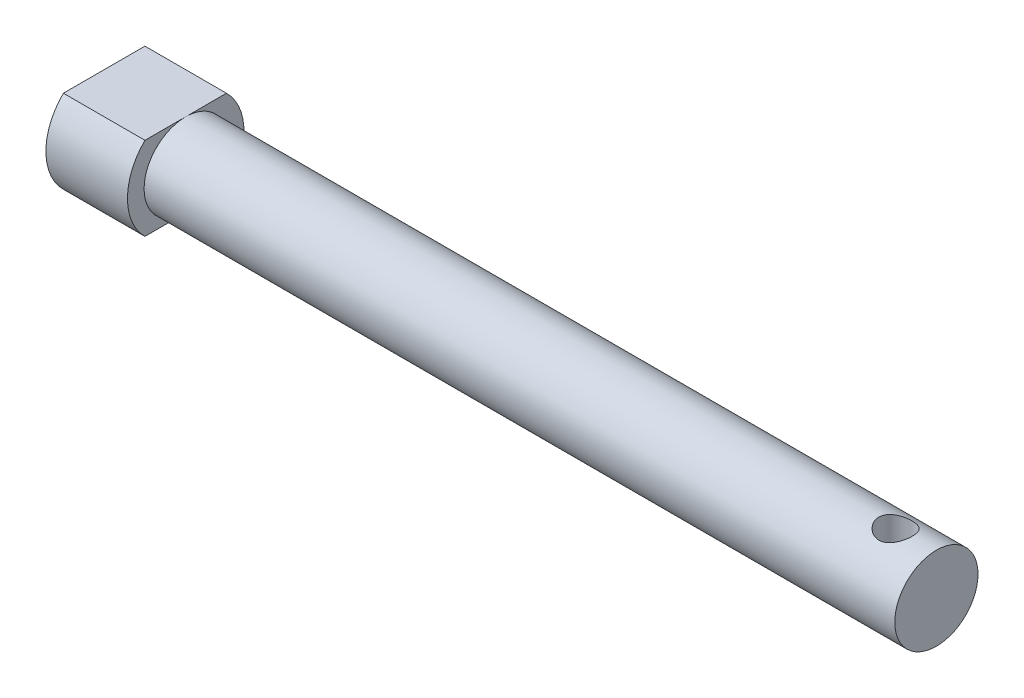
ISO-10303-21;
HEADER;
FILE_DESCRIPTION(('STEP AP214'),'2;1');
FILE_NAME('part.step','',(''),(''),'','','');
FILE_SCHEMA(('AUTOMOTIVE_DESIGN { 1 0 10303 214 1 1 1 1 }'));
ENDSEC;
DATA;
#1=APPLICATION_CONTEXT('core data for automotive mechanical design processes');
#2=APPLICATION_PROTOCOL_DEFINITION('international standard','automotive_design',2000,#1);
#3=PRODUCT_CONTEXT('',#1,'mechanical');
#4=PRODUCT('Part','Part','',(#3));
#5=PRODUCT_RELATED_PRODUCT_CATEGORY('part','',(#4));
#6=PRODUCT_DEFINITION_FORMATION('','',#4);
#7=PRODUCT_DEFINITION_CONTEXT('part definition',#1,'design');
#8=PRODUCT_DEFINITION('design','',#6,#7);
#9=PRODUCT_DEFINITION_SHAPE('','',#8);
#10=(LENGTH_UNIT() NAMED_UNIT(*) SI_UNIT(.MILLI.,.METRE.));
#11=(NAMED_UNIT(*) PLANE_ANGLE_UNIT() SI_UNIT($,.RADIAN.));
#12=(NAMED_UNIT(*) SI_UNIT($,.STERADIAN.) SOLID_ANGLE_UNIT());
#13=UNCERTAINTY_MEASURE_WITH_UNIT(LENGTH_MEASURE(1.E-05),#10,'distance_accuracy_value','');
#14=(GEOMETRIC_REPRESENTATION_CONTEXT(3) GLOBAL_UNCERTAINTY_ASSIGNED_CONTEXT((#13)) GLOBAL_UNIT_ASSIGNED_CONTEXT((#10,
#11,#12)) REPRESENTATION_CONTEXT('',''));
#15=CARTESIAN_POINT('',(0.,0.,0.));
#16=DIRECTION('',(0.,0.,1.));
#17=DIRECTION('',(1.,0.,0.));
#18=AXIS2_PLACEMENT_3D('',#15,#16,#17);
#19=CARTESIAN_POINT('',(25.,0.,0.));
#20=DIRECTION('',(-1.,0.,0.));
#21=DIRECTION('',(0.,0.,1.));
#22=AXIS2_PLACEMENT_3D('',#19,#20,#21);
#23=CYLINDRICAL_SURFACE('',#22,2.5);
#24=CARTESIAN_POINT('',(22.55,2.29128784747792,1.));
#25=CARTESIAN_POINT('',(22.4964302509501,2.29129325828211,0.999994127101896));
#26=CARTESIAN_POINT('',(22.4427847326477,2.29319301242133,0.995669909297178));
#27=CARTESIAN_POINT('',(22.3370325835615,2.30055457093922,0.978534515296367));
#28=CARTESIAN_POINT('',(22.2849302414598,2.30602547693426,0.965701652221067));
#29=CARTESIAN_POINT('',(22.183973529015,2.31980227895648,0.932117516284353));
#30=CARTESIAN_POINT('',(22.1351077263199,2.32809748178557,0.911396076262713));
#31=CARTESIAN_POINT('',(22.0415574745702,2.3465733254764,0.862710134685806));
#32=CARTESIAN_POINT('',(21.9968721154246,2.35675355451961,0.83474721463375));
#33=CARTESIAN_POINT('',(21.9103697988793,2.37850432525516,0.77066098729371));
#34=CARTESIAN_POINT('',(21.8688217885353,2.39011958979373,0.734189678863664));
#35=CARTESIAN_POINT('',(21.7922355013423,2.41306228489405,0.654854552887023));
#36=CARTESIAN_POINT('',(21.7571994993551,2.42438961368186,0.611988510837841));
#37=CARTESIAN_POINT('',(21.6932968015086,2.44601703953427,0.51900315517819));
#38=CARTESIAN_POINT('',(21.6647278492647,2.45625901841784,0.468664482806142));
#39=CARTESIAN_POINT('',(21.6165782158051,2.47401963815773,0.36341266143756));
#40=CARTESIAN_POINT('',(21.596993877109,2.48153938692337,0.308501384643981));
#41=CARTESIAN_POINT('',(21.5683292567813,2.49269162504142,0.198483213419445));
#42=CARTESIAN_POINT('',(21.5587863429555,2.49649468387678,0.143514492402302));
#43=CARTESIAN_POINT('',(21.5489857571687,2.50040155341351,0.0326331643188245));
#44=CARTESIAN_POINT('',(21.5487246220326,2.50050674384656,-0.0232790829127025));
#45=CARTESIAN_POINT('',(21.5572413848875,2.49710981410893,-0.131116247357657));
#46=CARTESIAN_POINT('',(21.5655123863735,2.49380998385918,-0.183088726437018));
#47=CARTESIAN_POINT('',(21.5899964381554,2.48424645734395,-0.28483655460917));
#48=CARTESIAN_POINT('',(21.6062100712002,2.47798254360556,-0.33461174219508));
#49=CARTESIAN_POINT('',(21.6463182414382,2.4629841222885,-0.431448969255829));
#50=CARTESIAN_POINT('',(21.6703248574078,2.454213802334,-0.478458811689819));
#51=CARTESIAN_POINT('',(21.7252325034595,2.43507292589849,-0.56790407537029));
#52=CARTESIAN_POINT('',(21.7561358965488,2.42470182132537,-0.610337921358056));
#53=CARTESIAN_POINT('',(21.8263245679733,2.40260818589167,-0.692384413996077));
#54=CARTESIAN_POINT('',(21.8660269462919,2.3908416326012,-0.731628922636823));
#55=CARTESIAN_POINT('',(21.9514952859105,2.36780830482389,-0.803053707692665));
#56=CARTESIAN_POINT('',(21.9972632240771,2.35654169488173,-0.835231671879831));
#57=CARTESIAN_POINT('',(22.0952095112045,2.33548448720906,-0.892452094371468));
#58=CARTESIAN_POINT('',(22.1475324152419,2.3257445709069,-0.917267325867454));
#59=CARTESIAN_POINT('',(22.256107745231,2.30943795233662,-0.957588129983134));
#60=CARTESIAN_POINT('',(22.3123575923854,2.3028691896167,-0.973099749202201));
#61=CARTESIAN_POINT('',(22.423517888718,2.29414879836282,-0.99347747441598));
#62=CARTESIAN_POINT('',(22.4783002235601,2.29175183224038,-0.998936048404206));
#63=CARTESIAN_POINT('',(22.588038603884,2.29094748938549,-1.00078066322451));
#64=CARTESIAN_POINT('',(22.6429945916389,2.29253890281231,-0.997169455296443));
#65=CARTESIAN_POINT('',(22.7482294674774,2.29928022178566,-0.981516447394264));
#66=CARTESIAN_POINT('',(22.7985964686997,2.30422228898885,-0.969966531011731));
#67=CARTESIAN_POINT('',(22.896644202393,2.31685025513936,-0.939402093455641));
#68=CARTESIAN_POINT('',(22.9443243365537,2.32453676244372,-0.920385917151199));
#69=CARTESIAN_POINT('',(23.0378011788977,2.34216890929975,-0.874567819740729));
#70=CARTESIAN_POINT('',(23.0834430943472,2.35219352319567,-0.847481434132299));
#71=CARTESIAN_POINT('',(23.1697414937208,2.37325192578919,-0.78658261222094));
#72=CARTESIAN_POINT('',(23.2103959363978,2.38428612448031,-0.752767436740994));
#73=CARTESIAN_POINT('',(23.2886867042996,2.40710457985699,-0.676422105840242));
#74=CARTESIAN_POINT('',(23.3258782826455,2.41888403642601,-0.633432714722548));
#75=CARTESIAN_POINT('',(23.3925885383052,2.44109897283781,-0.54154181668442));
#76=CARTESIAN_POINT('',(23.4221069032986,2.4515343979662,-0.49264006923393));
#77=CARTESIAN_POINT('',(23.4725238132306,2.46991857950143,-0.39013996700088));
#78=CARTESIAN_POINT('',(23.4934244220829,2.47786793120137,-0.336542740497032));
#79=CARTESIAN_POINT('',(23.5257744262038,2.49036356734645,-0.226196795459611));
#80=CARTESIAN_POINT('',(23.53722895072,2.49491169853772,-0.169449805147134));
#81=CARTESIAN_POINT('',(23.5497523508127,2.49989504105256,-0.0584082551731509));
#82=CARTESIAN_POINT('',(23.5514500642313,2.50057923372436,-0.00419524629652686));
#83=CARTESIAN_POINT('',(23.5460722603579,2.49843021189296,0.103716917866622));
#84=CARTESIAN_POINT('',(23.5389980711072,2.49559752983456,0.157416149697311));
#85=CARTESIAN_POINT('',(23.5167266058208,2.48685756682127,0.261085450973206));
#86=CARTESIAN_POINT('',(23.5017855269622,2.48104740317165,0.311119402324194));
#87=CARTESIAN_POINT('',(23.4644735977191,2.46697473916019,0.407961177379472));
#88=CARTESIAN_POINT('',(23.4421013769898,2.45871178652006,0.454768404133639));
#89=CARTESIAN_POINT('',(23.3894484007553,2.44009047180029,0.546101520928058));
#90=CARTESIAN_POINT('',(23.3588618525575,2.42965564864115,0.590435193403213));
#91=CARTESIAN_POINT('',(23.2911057404105,2.40794701593224,0.673527014262036));
#92=CARTESIAN_POINT('',(23.2539334517699,2.3966728602525,0.712282842872879));
#93=CARTESIAN_POINT('',(23.1713423877375,2.37368881779711,0.785600632542997));
#94=CARTESIAN_POINT('',(23.1255555632995,2.36199516302692,0.819754443599515));
#95=CARTESIAN_POINT('',(23.0285289312856,2.3402483573759,0.879923725219699));
#96=CARTESIAN_POINT('',(22.9772884835451,2.33019539943728,0.905938238949995));
#97=CARTESIAN_POINT('',(22.875481399076,2.31379432228954,0.946995543836656));
#98=CARTESIAN_POINT('',(22.8252673826244,2.30719459305824,0.962813757082104));
#99=CARTESIAN_POINT('',(22.7227572901848,2.29723001801982,0.986358878909194));
#100=CARTESIAN_POINT('',(22.6704674420165,2.29385616036088,0.994108333944009));
#101=CARTESIAN_POINT('',(22.595311218831,2.29162229378817,0.999232129155088));
#102=CARTESIAN_POINT('',(22.5726623895012,2.29128555846679,1.00000248449744));
#103=CARTESIAN_POINT('',(22.55,2.29128784747792,1.));
#104=B_SPLINE_CURVE_WITH_KNOTS('',3,(#24,#25,#26,#27,#28,#29,#30,#31,#32,#33,#34,#35,#36,#37,
#38,#39,#40,#41,#42,#43,#44,#45,#46,#47,#48,#49,#50,#51,#52,#53,#54,#55,#56,#57,#58,#59,#60,#61,
#62,#63,#64,#65,#66,#67,#68,#69,#70,#71,#72,#73,#74,#75,#76,#77,#78,#79,#80,#81,#82,#83,#84,#85,
#86,#87,#88,#89,#90,#91,#92,#93,#94,#95,#96,#97,#98,#99,#100,#101,#102,#103),.UNSPECIFIED.,.T.,
.F.,(4,2,2,2,2,2,2,2,2,2,2,2,2,2,2,2,2,2,2,2,2,2,2,2,2,2,2,2,2,2,2,2,2,2,2,2,2,2,2,4),(0.,
0.160638824383824,0.321688667911124,0.482135411646697,0.64254714411931,0.811278091422126,
0.980067871741711,1.15551334545714,1.3308873348474,1.49777091443592,1.66459222652836,
1.82204322415151,1.9795057756453,2.1393415011745,2.29923207470016,2.46962022040678,
2.64006403563564,2.81532229357289,2.99046652397056,3.15491073759216,3.31930507450975,
3.47433624039577,3.62940179322824,3.79075577323356,3.9521755725993,4.12551867120496,
4.2988688242338,4.47217743653412,4.64539187974074,4.80730519874982,4.96919400753307,
5.12610997218682,5.28305488911298,5.44693525566968,5.61088358279109,5.78498126639812,
5.959099408766,6.11758330406544,6.27562315106628,6.34358052760368),.UNSPECIFIED.);
#105=CARTESIAN_POINT('',(22.55,2.29128784747792,1.));
#106=VERTEX_POINT('',#105);
#107=EDGE_CURVE('E39',#106,#106,#104,.T.);
#108=ORIENTED_EDGE('',*,*,#107,.T.);
#109=EDGE_LOOP('',(#108));
#110=FACE_BOUND('',#109,.T.);
#111=CARTESIAN_POINT('',(21.55,-2.5,0.));
#112=CARTESIAN_POINT('',(21.5500049259119,-2.49999635613542,0.053746502721446));
#113=CARTESIAN_POINT('',(21.5543588760442,-2.49824647153466,0.107586282045337));
#114=CARTESIAN_POINT('',(21.5716238517606,-2.49141726550321,0.213748240208949));
#115=CARTESIAN_POINT('',(21.5845581395431,-2.48632889349439,0.266065888780625));
#116=CARTESIAN_POINT('',(21.6184380390294,-2.47337104606559,0.367476961363702));
#117=CARTESIAN_POINT('',(21.6393574231084,-2.46551068182036,0.416580330808479));
#118=CARTESIAN_POINT('',(21.6885095866633,-2.44778305398039,0.510535985164184));
#119=CARTESIAN_POINT('',(21.7167398274595,-2.43791648729028,0.555389738375497));
#120=CARTESIAN_POINT('',(21.7811177492805,-2.41665443085209,0.641750503785198));
#121=CARTESIAN_POINT('',(21.8175533281201,-2.40521148464595,0.683031136275107));
#122=CARTESIAN_POINT('',(21.8967000017384,-2.38230288453097,0.759087502392361));
#123=CARTESIAN_POINT('',(21.9394141486059,-2.37083722226896,0.793860053566767));
#124=CARTESIAN_POINT('',(22.0322140351211,-2.34861395898568,0.85743728364644));
#125=CARTESIAN_POINT('',(22.0825432430116,-2.33791057982476,0.885907490597737));
#126=CARTESIAN_POINT('',(22.18776819921,-2.31916823593396,0.933877359518575));
#127=CARTESIAN_POINT('',(22.2426617639242,-2.31112800622088,0.953381282142918));
#128=CARTESIAN_POINT('',(22.3528561667961,-2.29913178830409,0.981949411697935));
#129=CARTESIAN_POINT('',(22.4080256177881,-2.29500710177802,0.991446982902825));
#130=CARTESIAN_POINT('',(22.5193174991536,-2.29082002024572,1.00108648082002));
#131=CARTESIAN_POINT('',(22.5754394473125,-2.29075562761384,1.00123300815661));
#132=CARTESIAN_POINT('',(22.682878335729,-2.29455250139997,0.992494683752273));
#133=CARTESIAN_POINT('',(22.7342578572045,-2.29814087519225,0.98423765715257));
#134=CARTESIAN_POINT('',(22.8348297780034,-2.30838093803918,0.959973440148911));
#135=CARTESIAN_POINT('',(22.8840217940552,-2.31503316160836,0.943964897402317));
#136=CARTESIAN_POINT('',(22.980008918098,-2.33079742544265,0.904347366275538));
#137=CARTESIAN_POINT('',(23.0267346195273,-2.33995689640394,0.880589931157659));
#138=CARTESIAN_POINT('',(23.1157079081808,-2.35969058194945,0.826253230366108));
#139=CARTESIAN_POINT('',(23.1579538047014,-2.37026532728424,0.795671402550423));
#140=CARTESIAN_POINT('',(23.240204864401,-2.39263368371135,0.725775299727219));
#141=CARTESIAN_POINT('',(23.279784364723,-2.40445832488076,0.685968731485319));
#142=CARTESIAN_POINT('',(23.351842239001,-2.42729912479141,0.600157213715098));
#143=CARTESIAN_POINT('',(23.3843191987051,-2.43831512222662,0.554151032667219));
#144=CARTESIAN_POINT('',(23.4418087237079,-2.45857340632274,0.456038826302923));
#145=CARTESIAN_POINT('',(23.4666611405985,-2.46777635047707,0.403830245673241));
#146=CARTESIAN_POINT('',(23.507083930539,-2.48307414164379,0.295511882741443));
#147=CARTESIAN_POINT('',(23.5226590187787,-2.48917056731191,0.239404098424838));
#148=CARTESIAN_POINT('',(23.5432241477099,-2.49728069753455,0.128447943803911));
#149=CARTESIAN_POINT('',(23.5487862271268,-2.49951472916757,0.0737216469927682));
#150=CARTESIAN_POINT('',(23.5508565502643,-2.50034239255315,-0.035922654903908));
#151=CARTESIAN_POINT('',(23.5473671407738,-2.49893696791146,-0.0908406066119613));
#152=CARTESIAN_POINT('',(23.531854123724,-2.49278783531876,-0.196716369560994));
#153=CARTESIAN_POINT('',(23.5202210098245,-2.48819695672762,-0.247741245887737));
#154=CARTESIAN_POINT('',(23.4892821458451,-2.4762972070275,-0.34706771403039));
#155=CARTESIAN_POINT('',(23.4699754101657,-2.46898798678265,-0.395368955112422));
#156=CARTESIAN_POINT('',(23.42360753016,-2.45208297385406,-0.489539392908351));
#157=CARTESIAN_POINT('',(23.3963272639784,-2.44242407989902,-0.535289011377703));
#158=CARTESIAN_POINT('',(23.3350298380472,-2.42186682372762,-0.621721795623278));
#159=CARTESIAN_POINT('',(23.3010099785387,-2.41096796555135,-0.662402920380563));
#160=CARTESIAN_POINT('',(23.2245649935252,-2.38822558819056,-0.74036152151441));
#161=CARTESIAN_POINT('',(23.1817332292469,-2.37636720712526,-0.777236966903033));
#162=CARTESIAN_POINT('',(23.0902799584953,-2.35370836458566,-0.843375598706857));
#163=CARTESIAN_POINT('',(23.04165749983,-2.34290807763255,-0.872637530668756));
#164=CARTESIAN_POINT('',(22.9392691527029,-2.32357149953854,-0.922903750965814));
#165=CARTESIAN_POINT('',(22.8854580003939,-2.31505815442394,-0.943825297267227));
#166=CARTESIAN_POINT('',(22.7746331741424,-2.30161836738966,-0.976148109852653));
#167=CARTESIAN_POINT('',(22.7176218970938,-2.29668927847999,-0.987556402634659));
#168=CARTESIAN_POINT('',(22.6064360491127,-2.29135879649963,-0.999857808639202));
#169=CARTESIAN_POINT('',(22.5523525802033,-2.29065710504086,-1.00144854115144));
#170=CARTESIAN_POINT('',(22.4447275711434,-2.29307418016549,-0.995901579638764));
#171=CARTESIAN_POINT('',(22.3911859630487,-2.29619246162397,-0.988764993956893));
#172=CARTESIAN_POINT('',(22.2883339050725,-2.3056332453951,-0.966535683076826));
#173=CARTESIAN_POINT('',(22.2389398627835,-2.31182415913725,-0.95176874678549));
#174=CARTESIAN_POINT('',(22.1433106851933,-2.32662000616348,-0.915002724245508));
#175=CARTESIAN_POINT('',(22.0970764265501,-2.33522560603003,-0.893001640696907));
#176=CARTESIAN_POINT('',(22.0061951903646,-2.35449304802246,-0.840936381379866));
#177=CARTESIAN_POINT('',(21.9617906649348,-2.36524441156621,-0.810482667579746));
#178=CARTESIAN_POINT('',(21.8785033413981,-2.38731902186119,-0.74294605963575));
#179=CARTESIAN_POINT('',(21.8396222139358,-2.39864244024203,-0.705861167409063));
#180=CARTESIAN_POINT('',(21.7658985733682,-2.42146783543697,-0.623252753136233));
#181=CARTESIAN_POINT('',(21.731481346551,-2.43293378981093,-0.57733800057307));
#182=CARTESIAN_POINT('',(21.6708314786892,-2.45400203356858,-0.479950160142889));
#183=CARTESIAN_POINT('',(21.6446026439237,-2.46360345546453,-0.428474502273618));
#184=CARTESIAN_POINT('',(21.6016888924049,-2.47969857407931,-0.3223690312476));
#185=CARTESIAN_POINT('',(21.5848353382198,-2.48624681527514,-0.267815809109847));
#186=CARTESIAN_POINT('',(21.5606804395229,-2.49572153104683,-0.156438273140611));
#187=CARTESIAN_POINT('',(21.553348781628,-2.49865949747819,-0.0996217629294574));
#188=CARTESIAN_POINT('',(21.5503023095109,-2.49987949752068,-0.0284561489454658));
#189=CARTESIAN_POINT('',(21.5499986956854,-2.50000096484588,-0.0142313443703797));
#190=CARTESIAN_POINT('',(21.55,-2.5,0.));
#191=B_SPLINE_CURVE_WITH_KNOTS('',3,(#111,#112,#113,#114,#115,#116,#117,#118,#119,#120,#121,
#122,#123,#124,#125,#126,#127,#128,#129,#130,#131,#132,#133,#134,#135,#136,#137,#138,#139,#140,
#141,#142,#143,#144,#145,#146,#147,#148,#149,#150,#151,#152,#153,#154,#155,#156,#157,#158,#159,
#160,#161,#162,#163,#164,#165,#166,#167,#168,#169,#170,#171,#172,#173,#174,#175,#176,#177,#178,
#179,#180,#181,#182,#183,#184,#185,#186,#187,#188,#189,#190),.UNSPECIFIED.,.T.,.F.,(4,2,2,2,2,2,
2,2,2,2,2,2,2,2,2,2,2,2,2,2,2,2,2,2,2,2,2,2,2,2,2,2,2,2,2,2,2,2,2,4),(0.,0.161201493946536,
0.322841818003967,0.48395572873579,0.645013767839921,0.812986908501987,0.981041974672057,
1.15657629409608,1.33202711559134,1.49952052654415,1.66693153170244,1.82269164200686,
1.97847893628024,2.13744563149408,2.29647210969092,2.46779174593279,2.63914546419867,
2.81388456581403,2.98853478056895,3.15284592264004,3.31711446785041,3.47400227782183,
3.63091024496899,3.79261756699132,3.95438979749485,4.12684237312208,4.29932334521875,
4.47347522570414,4.64749836322967,4.80899836696375,4.97047786281524,5.12557159274385,
5.28070817902582,5.44472734028347,5.60879600674197,5.78350211766919,5.95828931820268,
6.1298215050666,6.30080626202172,6.34349022948399),.UNSPECIFIED.);
#192=CARTESIAN_POINT('',(21.55,-2.5,0.));
#193=VERTEX_POINT('',#192);
#194=EDGE_CURVE('E11',#193,#193,#191,.T.);
#195=ORIENTED_EDGE('',*,*,#194,.T.);
#196=EDGE_LOOP('',(#195));
#197=FACE_BOUND('',#196,.T.);
#198=CARTESIAN_POINT('',(25.,0.,0.));
#199=DIRECTION('',(1.,0.,0.));
#200=DIRECTION('',(0.,0.,-1.));
#201=AXIS2_PLACEMENT_3D('',#198,#199,#200);
#202=CIRCLE('',#201,2.5);
#203=CARTESIAN_POINT('',(25.,0.,-2.5));
#204=VERTEX_POINT('',#203);
#205=EDGE_CURVE('E49',#204,#204,#202,.T.);
#206=ORIENTED_EDGE('',*,*,#205,.F.);
#207=EDGE_LOOP('',(#206));
#208=FACE_BOUND('',#207,.T.);
#209=CARTESIAN_POINT('',(-20.1,0.,0.));
#210=DIRECTION('',(-1.,0.,0.));
#211=DIRECTION('',(0.,0.,1.));
#212=AXIS2_PLACEMENT_3D('',#209,#210,#211);
#213=CIRCLE('',#212,2.5);
#214=CARTESIAN_POINT('',(-20.1,2.5,0.));
#215=VERTEX_POINT('',#214);
#216=CARTESIAN_POINT('',(-20.1,-2.5,0.));
#217=VERTEX_POINT('',#216);
#218=EDGE_CURVE('E78',#215,#217,#213,.T.);
#219=ORIENTED_EDGE('',*,*,#218,.F.);
#220=CARTESIAN_POINT('',(-20.1,0.,0.));
#221=DIRECTION('',(-1.,0.,0.));
#222=DIRECTION('',(0.,0.,1.));
#223=AXIS2_PLACEMENT_3D('',#220,#221,#222);
#224=CIRCLE('',#223,2.5);
#225=EDGE_CURVE('E123',#217,#215,#224,.T.);
#226=ORIENTED_EDGE('',*,*,#225,.F.);
#227=EDGE_LOOP('',(#219,#226));
#228=FACE_BOUND('',#227,.T.);
#229=ADVANCED_FACE('F35',(#110,#197,#208,#228),#23,.T.);
#230=CARTESIAN_POINT('',(25.,0.,0.));
#231=DIRECTION('',(1.,0.,0.));
#232=DIRECTION('',(0.,0.,-1.));
#233=AXIS2_PLACEMENT_3D('',#230,#231,#232);
#234=PLANE('',#233);
#235=ORIENTED_EDGE('',*,*,#205,.T.);
#236=EDGE_LOOP('',(#235));
#237=FACE_BOUND('',#236,.T.);
#238=ADVANCED_FACE('F162',(#237),#234,.T.);
#239=CARTESIAN_POINT('',(-25.,0.,0.));
#240=DIRECTION('',(1.,0.,0.));
#241=DIRECTION('',(0.,0.,-1.));
#242=AXIS2_PLACEMENT_3D('',#239,#240,#241);
#243=PLANE('',#242);
#244=DIRECTION('',(0.,0.,1.));
#245=VECTOR('',#244,1.);
#246=CARTESIAN_POINT('',(-25.,2.5,0.));
#247=LINE('',#246,#245);
#248=CARTESIAN_POINT('',(-25.,2.5,-2.44948974278318));
#249=VERTEX_POINT('',#248);
#250=CARTESIAN_POINT('',(-25.,2.5,2.44948974278318));
#251=VERTEX_POINT('',#250);
#252=EDGE_CURVE('E119',#249,#251,#247,.T.);
#253=ORIENTED_EDGE('',*,*,#252,.F.);
#254=CARTESIAN_POINT('',(-25.,0.,0.));
#255=DIRECTION('',(-1.,0.,0.));
#256=DIRECTION('',(0.,0.,1.));
#257=AXIS2_PLACEMENT_3D('',#254,#255,#256);
#258=CIRCLE('',#257,3.5);
#259=CARTESIAN_POINT('',(-25.,-2.5,-2.44948974278318));
#260=VERTEX_POINT('',#259);
#261=EDGE_CURVE('E101',#249,#260,#258,.T.);
#262=ORIENTED_EDGE('',*,*,#261,.T.);
#263=DIRECTION('',(0.,0.,1.));
#264=VECTOR('',#263,1.);
#265=CARTESIAN_POINT('',(-25.,-2.5,0.));
#266=LINE('',#265,#264);
#267=CARTESIAN_POINT('',(-25.,-2.5,2.44948974278318));
#268=VERTEX_POINT('',#267);
#269=EDGE_CURVE('E125',#260,#268,#266,.T.);
#270=ORIENTED_EDGE('',*,*,#269,.T.);
#271=CARTESIAN_POINT('',(-25.,0.,0.));
#272=DIRECTION('',(-1.,0.,0.));
#273=DIRECTION('',(0.,0.,1.));
#274=AXIS2_PLACEMENT_3D('',#271,#272,#273);
#275=CIRCLE('',#274,3.5);
#276=EDGE_CURVE('E128',#268,#251,#275,.T.);
#277=ORIENTED_EDGE('',*,*,#276,.T.);
#278=EDGE_LOOP('',(#253,#262,#270,#277));
#279=FACE_BOUND('',#278,.T.);
#280=ADVANCED_FACE('F161',(#279),#243,.F.);
#281=CARTESIAN_POINT('',(-20.1,-2.5,0.));
#282=DIRECTION('',(0.,-1.,0.));
#283=DIRECTION('',(0.,0.,-1.));
#284=AXIS2_PLACEMENT_3D('',#281,#282,#283);
#285=PLANE('',#284);
#286=ORIENTED_EDGE('',*,*,#269,.F.);
#287=DIRECTION('',(-1.,0.,0.));
#288=VECTOR('',#287,1.);
#289=CARTESIAN_POINT('',(-20.1,-2.5,-2.44948974278318));
#290=LINE('',#289,#288);
#291=CARTESIAN_POINT('',(-20.1,-2.5,-2.44948974278318));
#292=VERTEX_POINT('',#291);
#293=EDGE_CURVE('E108',#292,#260,#290,.T.);
#294=ORIENTED_EDGE('',*,*,#293,.F.);
#295=DIRECTION('',(0.,0.,1.));
#296=VECTOR('',#295,1.);
#297=CARTESIAN_POINT('',(-20.1,-2.5,0.));
#298=LINE('',#297,#296);
#299=EDGE_CURVE('E104',#292,#217,#298,.T.);
#300=ORIENTED_EDGE('',*,*,#299,.T.);
#301=DIRECTION('',(0.,0.,1.));
#302=VECTOR('',#301,1.);
#303=CARTESIAN_POINT('',(-20.1,-2.5,0.));
#304=LINE('',#303,#302);
#305=CARTESIAN_POINT('',(-20.1,-2.5,2.44948974278318));
#306=VERTEX_POINT('',#305);
#307=EDGE_CURVE('E116',#217,#306,#304,.T.);
#308=ORIENTED_EDGE('',*,*,#307,.T.);
#309=DIRECTION('',(-1.,0.,0.));
#310=VECTOR('',#309,1.);
#311=CARTESIAN_POINT('',(-20.1,-2.5,2.44948974278318));
#312=LINE('',#311,#310);
#313=EDGE_CURVE('E68',#306,#268,#312,.T.);
#314=ORIENTED_EDGE('',*,*,#313,.T.);
#315=EDGE_LOOP('',(#286,#294,#300,#308,#314));
#316=FACE_BOUND('',#315,.T.);
#317=ADVANCED_FACE('F155',(#316),#285,.T.);
#318=CARTESIAN_POINT('',(-20.1,2.5,0.));
#319=DIRECTION('',(0.,-1.,0.));
#320=DIRECTION('',(0.,0.,-1.));
#321=AXIS2_PLACEMENT_3D('',#318,#319,#320);
#322=PLANE('',#321);
#323=ORIENTED_EDGE('',*,*,#252,.T.);
#324=DIRECTION('',(-1.,0.,0.));
#325=VECTOR('',#324,1.);
#326=CARTESIAN_POINT('',(-20.1,2.5,2.44948974278318));
#327=LINE('',#326,#325);
#328=CARTESIAN_POINT('',(-20.1,2.5,2.44948974278318));
#329=VERTEX_POINT('',#328);
#330=EDGE_CURVE('E132',#329,#251,#327,.T.);
#331=ORIENTED_EDGE('',*,*,#330,.F.);
#332=DIRECTION('',(0.,0.,1.));
#333=VECTOR('',#332,1.);
#334=CARTESIAN_POINT('',(-20.1,2.5,0.));
#335=LINE('',#334,#333);
#336=EDGE_CURVE('E57',#215,#329,#335,.T.);
#337=ORIENTED_EDGE('',*,*,#336,.F.);
#338=DIRECTION('',(0.,0.,1.));
#339=VECTOR('',#338,1.);
#340=CARTESIAN_POINT('',(-20.1,2.5,0.));
#341=LINE('',#340,#339);
#342=CARTESIAN_POINT('',(-20.1,2.5,-2.44948974278318));
#343=VERTEX_POINT('',#342);
#344=EDGE_CURVE('E106',#343,#215,#341,.T.);
#345=ORIENTED_EDGE('',*,*,#344,.F.);
#346=DIRECTION('',(-1.,0.,0.));
#347=VECTOR('',#346,1.);
#348=CARTESIAN_POINT('',(-20.1,2.5,-2.44948974278318));
#349=LINE('',#348,#347);
#350=EDGE_CURVE('E93',#343,#249,#349,.T.);
#351=ORIENTED_EDGE('',*,*,#350,.T.);
#352=EDGE_LOOP('',(#323,#331,#337,#345,#351));
#353=FACE_BOUND('',#352,.T.);
#354=ADVANCED_FACE('F107',(#353),#322,.F.);
#355=CARTESIAN_POINT('',(-20.1,0.,0.));
#356=DIRECTION('',(-1.,0.,0.));
#357=DIRECTION('',(0.,0.,1.));
#358=AXIS2_PLACEMENT_3D('',#355,#356,#357);
#359=CYLINDRICAL_SURFACE('',#358,3.5);
#360=ORIENTED_EDGE('',*,*,#276,.F.);
#361=ORIENTED_EDGE('',*,*,#313,.F.);
#362=CARTESIAN_POINT('',(-20.1,0.,0.));
#363=DIRECTION('',(-1.,0.,0.));
#364=DIRECTION('',(0.,0.,1.));
#365=AXIS2_PLACEMENT_3D('',#362,#363,#364);
#366=CIRCLE('',#365,3.5);
#367=EDGE_CURVE('E118',#306,#329,#366,.T.);
#368=ORIENTED_EDGE('',*,*,#367,.T.);
#369=ORIENTED_EDGE('',*,*,#330,.T.);
#370=EDGE_LOOP('',(#360,#361,#368,#369));
#371=FACE_BOUND('',#370,.T.);
#372=ADVANCED_FACE('F152',(#371),#359,.T.);
#373=CARTESIAN_POINT('',(-20.1,0.,0.));
#374=DIRECTION('',(-1.,0.,0.));
#375=DIRECTION('',(0.,0.,1.));
#376=AXIS2_PLACEMENT_3D('',#373,#374,#375);
#377=PLANE('',#376);
#378=ORIENTED_EDGE('',*,*,#307,.F.);
#379=ORIENTED_EDGE('',*,*,#225,.T.);
#380=ORIENTED_EDGE('',*,*,#336,.T.);
#381=ORIENTED_EDGE('',*,*,#367,.F.);
#382=EDGE_LOOP('',(#378,#379,#380,#381));
#383=FACE_BOUND('',#382,.T.);
#384=ADVANCED_FACE('F147',(#383),#377,.F.);
#385=CARTESIAN_POINT('',(-20.1,0.,0.));
#386=DIRECTION('',(-1.,0.,0.));
#387=DIRECTION('',(0.,0.,1.));
#388=AXIS2_PLACEMENT_3D('',#385,#386,#387);
#389=CYLINDRICAL_SURFACE('',#388,3.5);
#390=ORIENTED_EDGE('',*,*,#261,.F.);
#391=ORIENTED_EDGE('',*,*,#350,.F.);
#392=CARTESIAN_POINT('',(-20.1,0.,0.));
#393=DIRECTION('',(-1.,0.,0.));
#394=DIRECTION('',(0.,0.,1.));
#395=AXIS2_PLACEMENT_3D('',#392,#393,#394);
#396=CIRCLE('',#395,3.5);
#397=EDGE_CURVE('E98',#343,#292,#396,.T.);
#398=ORIENTED_EDGE('',*,*,#397,.T.);
#399=ORIENTED_EDGE('',*,*,#293,.T.);
#400=EDGE_LOOP('',(#390,#391,#398,#399));
#401=FACE_BOUND('',#400,.T.);
#402=ADVANCED_FACE('F95',(#401),#389,.T.);
#403=CARTESIAN_POINT('',(-20.1,0.,0.));
#404=DIRECTION('',(-1.,0.,0.));
#405=DIRECTION('',(0.,0.,1.));
#406=AXIS2_PLACEMENT_3D('',#403,#404,#405);
#407=PLANE('',#406);
#408=ORIENTED_EDGE('',*,*,#344,.T.);
#409=ORIENTED_EDGE('',*,*,#218,.T.);
#410=ORIENTED_EDGE('',*,*,#299,.F.);
#411=ORIENTED_EDGE('',*,*,#397,.F.);
#412=EDGE_LOOP('',(#408,#409,#410,#411));
#413=FACE_BOUND('',#412,.T.);
#414=ADVANCED_FACE('F110',(#413),#407,.F.);
#415=CARTESIAN_POINT('',(22.55,-2.5,0.));
#416=DIRECTION('',(0.,1.,0.));
#417=DIRECTION('',(0.,0.,1.));
#418=AXIS2_PLACEMENT_3D('',#415,#416,#417);
#419=CYLINDRICAL_SURFACE('',#418,1.);
#420=ORIENTED_EDGE('',*,*,#107,.F.);
#421=EDGE_LOOP('',(#420));
#422=FACE_BOUND('',#421,.T.);
#423=ORIENTED_EDGE('',*,*,#194,.F.);
#424=EDGE_LOOP('',(#423));
#425=FACE_BOUND('',#424,.T.);
#426=ADVANCED_FACE('F139',(#422,#425),#419,.F.);
#427=CLOSED_SHELL('',(#229,#238,#280,#317,#354,#372,#384,#402,#414,#426));
#428=MANIFOLD_SOLID_BREP('B2',#427);
#429=ADVANCED_BREP_SHAPE_REPRESENTATION('',(#18,#428),#14);
#430=SHAPE_DEFINITION_REPRESENTATION(#9,#429);
ENDSEC;
END-ISO-10303-21;
